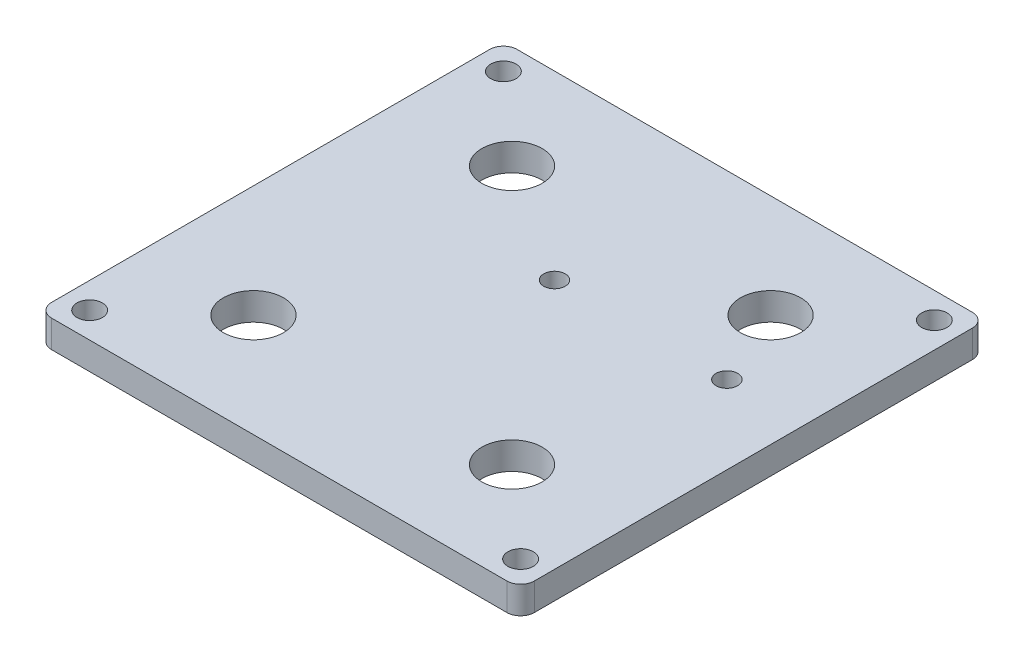
ISO-10303-21;
HEADER;
FILE_DESCRIPTION(('STEP AP214'),'2;1');
FILE_NAME('part.step','',(''),(''),'','','');
FILE_SCHEMA(('AUTOMOTIVE_DESIGN { 1 0 10303 214 1 1 1 1 }'));
ENDSEC;
DATA;
#1=APPLICATION_CONTEXT('core data for automotive mechanical design processes');
#2=APPLICATION_PROTOCOL_DEFINITION('international standard','automotive_design',2000,#1);
#3=PRODUCT_CONTEXT('',#1,'mechanical');
#4=PRODUCT('Part','Part','',(#3));
#5=PRODUCT_RELATED_PRODUCT_CATEGORY('part','',(#4));
#6=PRODUCT_DEFINITION_FORMATION('','',#4);
#7=PRODUCT_DEFINITION_CONTEXT('part definition',#1,'design');
#8=PRODUCT_DEFINITION('design','',#6,#7);
#9=PRODUCT_DEFINITION_SHAPE('','',#8);
#10=(LENGTH_UNIT() NAMED_UNIT(*) SI_UNIT(.MILLI.,.METRE.));
#11=(NAMED_UNIT(*) PLANE_ANGLE_UNIT() SI_UNIT($,.RADIAN.));
#12=(NAMED_UNIT(*) SI_UNIT($,.STERADIAN.) SOLID_ANGLE_UNIT());
#13=UNCERTAINTY_MEASURE_WITH_UNIT(LENGTH_MEASURE(1.E-05),#10,'distance_accuracy_value','');
#14=(GEOMETRIC_REPRESENTATION_CONTEXT(3) GLOBAL_UNCERTAINTY_ASSIGNED_CONTEXT((#13)) GLOBAL_UNIT_ASSIGNED_CONTEXT((#10,
#11,#12)) REPRESENTATION_CONTEXT('',''));
#15=CARTESIAN_POINT('',(0.,0.,0.));
#16=DIRECTION('',(0.,0.,1.));
#17=DIRECTION('',(1.,0.,0.));
#18=AXIS2_PLACEMENT_3D('',#15,#16,#17);
#19=CARTESIAN_POINT('',(0.,0.,0.));
#20=DIRECTION('',(0.,1.,0.));
#21=DIRECTION('',(0.,0.,1.));
#22=AXIS2_PLACEMENT_3D('',#19,#20,#21);
#23=PLANE('',#22);
#24=CARTESIAN_POINT('',(40.93,0.,16.));
#25=DIRECTION('',(0.,1.,0.));
#26=DIRECTION('',(0.,0.,1.));
#27=AXIS2_PLACEMENT_3D('',#24,#25,#26);
#28=CIRCLE('',#27,1.25);
#29=CARTESIAN_POINT('',(40.93,0.,17.25));
#30=VERTEX_POINT('',#29);
#31=EDGE_CURVE('E616',#30,#30,#28,.T.);
#32=ORIENTED_EDGE('',*,*,#31,.T.);
#33=EDGE_LOOP('',(#32));
#34=FACE_BOUND('',#33,.T.);
#35=CARTESIAN_POINT('',(20.93,0.,16.));
#36=DIRECTION('',(0.,1.,0.));
#37=DIRECTION('',(0.,0.,1.));
#38=AXIS2_PLACEMENT_3D('',#35,#36,#37);
#39=CIRCLE('',#38,1.25);
#40=CARTESIAN_POINT('',(20.93,0.,17.25));
#41=VERTEX_POINT('',#40);
#42=EDGE_CURVE('E305',#41,#41,#39,.T.);
#43=ORIENTED_EDGE('',*,*,#42,.T.);
#44=EDGE_LOOP('',(#43));
#45=FACE_BOUND('',#44,.T.);
#46=DIRECTION('',(1.,0.,0.));
#47=VECTOR('',#46,1.);
#48=CARTESIAN_POINT('',(0.,0.,-5.));
#49=LINE('',#48,#47);
#50=CARTESIAN_POINT('',(-4.41249999999999,0.,-5.));
#51=VERTEX_POINT('',#50);
#52=CARTESIAN_POINT('',(48.4125,0.,-5.));
#53=VERTEX_POINT('',#52);
#54=EDGE_CURVE('E146',#51,#53,#49,.T.);
#55=ORIENTED_EDGE('',*,*,#54,.T.);
#56=CARTESIAN_POINT('',(48.4125,0.,-3.4125));
#57=DIRECTION('',(0.,1.,0.));
#58=DIRECTION('',(0.,0.,1.));
#59=AXIS2_PLACEMENT_3D('',#56,#57,#58);
#60=CIRCLE('',#59,1.5875);
#61=CARTESIAN_POINT('',(50.,0.,-3.4125));
#62=VERTEX_POINT('',#61);
#63=EDGE_CURVE('E140',#53,#62,#60,.F.);
#64=ORIENTED_EDGE('',*,*,#63,.T.);
#65=DIRECTION('',(0.,0.,1.));
#66=VECTOR('',#65,1.);
#67=CARTESIAN_POINT('',(50.,0.,-5.00000000000001));
#68=LINE('',#67,#66);
#69=CARTESIAN_POINT('',(50.,0.,47.4125));
#70=VERTEX_POINT('',#69);
#71=EDGE_CURVE('E143',#62,#70,#68,.T.);
#72=ORIENTED_EDGE('',*,*,#71,.T.);
#73=CARTESIAN_POINT('',(48.4125,0.,47.4125));
#74=DIRECTION('',(0.,1.,0.));
#75=DIRECTION('',(0.,0.,1.));
#76=AXIS2_PLACEMENT_3D('',#73,#74,#75);
#77=CIRCLE('',#76,1.5875);
#78=CARTESIAN_POINT('',(48.4125,0.,49.));
#79=VERTEX_POINT('',#78);
#80=EDGE_CURVE('E152',#70,#79,#77,.F.);
#81=ORIENTED_EDGE('',*,*,#80,.T.);
#82=DIRECTION('',(1.,0.,0.));
#83=VECTOR('',#82,1.);
#84=CARTESIAN_POINT('',(0.,0.,49.));
#85=LINE('',#84,#83);
#86=CARTESIAN_POINT('',(-4.41249999999999,0.,49.));
#87=VERTEX_POINT('',#86);
#88=EDGE_CURVE('E213',#87,#79,#85,.T.);
#89=ORIENTED_EDGE('',*,*,#88,.F.);
#90=CARTESIAN_POINT('',(-4.41249999999999,0.,47.4125));
#91=DIRECTION('',(0.,1.,0.));
#92=DIRECTION('',(0.,0.,1.));
#93=AXIS2_PLACEMENT_3D('',#90,#91,#92);
#94=CIRCLE('',#93,1.5875);
#95=CARTESIAN_POINT('',(-5.99999999999999,0.,47.4125));
#96=VERTEX_POINT('',#95);
#97=EDGE_CURVE('E95',#87,#96,#94,.F.);
#98=ORIENTED_EDGE('',*,*,#97,.T.);
#99=DIRECTION('',(0.,0.,-1.));
#100=VECTOR('',#99,1.);
#101=CARTESIAN_POINT('',(-5.99999999999999,0.,-5.));
#102=LINE('',#101,#100);
#103=CARTESIAN_POINT('',(-5.99999999999999,0.,-3.4125));
#104=VERTEX_POINT('',#103);
#105=EDGE_CURVE('E309',#96,#104,#102,.T.);
#106=ORIENTED_EDGE('',*,*,#105,.T.);
#107=CARTESIAN_POINT('',(-4.41249999999999,0.,-3.4125));
#108=DIRECTION('',(0.,1.,0.));
#109=DIRECTION('',(0.,0.,1.));
#110=AXIS2_PLACEMENT_3D('',#107,#108,#109);
#111=CIRCLE('',#110,1.5875);
#112=EDGE_CURVE('E193',#104,#51,#111,.F.);
#113=ORIENTED_EDGE('',*,*,#112,.T.);
#114=EDGE_LOOP('',(#55,#64,#72,#81,#89,#98,#106,#113));
#115=FACE_BOUND('',#114,.T.);
#116=CARTESIAN_POINT('',(7.,0.,7.));
#117=DIRECTION('',(0.,1.,0.));
#118=DIRECTION('',(0.,0.,1.));
#119=AXIS2_PLACEMENT_3D('',#116,#117,#118);
#120=CIRCLE('',#119,3.5);
#121=CARTESIAN_POINT('',(7.,0.,10.5));
#122=VERTEX_POINT('',#121);
#123=EDGE_CURVE('E241',#122,#122,#120,.T.);
#124=ORIENTED_EDGE('',*,*,#123,.T.);
#125=EDGE_LOOP('',(#124));
#126=FACE_BOUND('',#125,.T.);
#127=CARTESIAN_POINT('',(37.,0.,7.));
#128=DIRECTION('',(0.,1.,0.));
#129=DIRECTION('',(0.,0.,1.));
#130=AXIS2_PLACEMENT_3D('',#127,#128,#129);
#131=CIRCLE('',#130,3.5);
#132=CARTESIAN_POINT('',(37.,0.,10.5));
#133=VERTEX_POINT('',#132);
#134=EDGE_CURVE('E237',#133,#133,#131,.T.);
#135=ORIENTED_EDGE('',*,*,#134,.T.);
#136=EDGE_LOOP('',(#135));
#137=FACE_BOUND('',#136,.T.);
#138=CARTESIAN_POINT('',(37.,0.,37.));
#139=DIRECTION('',(0.,1.,0.));
#140=DIRECTION('',(0.,0.,1.));
#141=AXIS2_PLACEMENT_3D('',#138,#139,#140);
#142=CIRCLE('',#141,3.5);
#143=CARTESIAN_POINT('',(37.,0.,40.5));
#144=VERTEX_POINT('',#143);
#145=EDGE_CURVE('E232',#144,#144,#142,.T.);
#146=ORIENTED_EDGE('',*,*,#145,.T.);
#147=EDGE_LOOP('',(#146));
#148=FACE_BOUND('',#147,.T.);
#149=CARTESIAN_POINT('',(7.,0.,37.));
#150=DIRECTION('',(0.,1.,0.));
#151=DIRECTION('',(0.,0.,1.));
#152=AXIS2_PLACEMENT_3D('',#149,#150,#151);
#153=CIRCLE('',#152,3.5);
#154=CARTESIAN_POINT('',(7.,0.,40.5));
#155=VERTEX_POINT('',#154);
#156=EDGE_CURVE('E228',#155,#155,#153,.T.);
#157=ORIENTED_EDGE('',*,*,#156,.T.);
#158=EDGE_LOOP('',(#157));
#159=FACE_BOUND('',#158,.T.);
#160=CARTESIAN_POINT('',(-2.99999999999999,0.,-2.));
#161=DIRECTION('',(0.,1.,0.));
#162=DIRECTION('',(0.,0.,1.));
#163=AXIS2_PLACEMENT_3D('',#160,#161,#162);
#164=CIRCLE('',#163,1.4732);
#165=CARTESIAN_POINT('',(-2.99999999999999,0.,-0.526800000000005));
#166=VERTEX_POINT('',#165);
#167=EDGE_CURVE('E259',#166,#166,#164,.F.);
#168=ORIENTED_EDGE('',*,*,#167,.F.);
#169=EDGE_LOOP('',(#168));
#170=FACE_BOUND('',#169,.T.);
#171=CARTESIAN_POINT('',(-3.,0.,46.));
#172=DIRECTION('',(0.,1.,0.));
#173=DIRECTION('',(0.,0.,1.));
#174=AXIS2_PLACEMENT_3D('',#171,#172,#173);
#175=CIRCLE('',#174,1.4732);
#176=CARTESIAN_POINT('',(-3.,0.,47.4732));
#177=VERTEX_POINT('',#176);
#178=EDGE_CURVE('E233',#177,#177,#175,.F.);
#179=ORIENTED_EDGE('',*,*,#178,.F.);
#180=EDGE_LOOP('',(#179));
#181=FACE_BOUND('',#180,.T.);
#182=CARTESIAN_POINT('',(47.,0.,-2.00000000000001));
#183=DIRECTION('',(0.,1.,0.));
#184=DIRECTION('',(0.,0.,1.));
#185=AXIS2_PLACEMENT_3D('',#182,#183,#184);
#186=CIRCLE('',#185,1.4732);
#187=CARTESIAN_POINT('',(47.,0.,-0.526800000000005));
#188=VERTEX_POINT('',#187);
#189=EDGE_CURVE('E164',#188,#188,#186,.F.);
#190=ORIENTED_EDGE('',*,*,#189,.F.);
#191=EDGE_LOOP('',(#190));
#192=FACE_BOUND('',#191,.T.);
#193=CARTESIAN_POINT('',(47.,0.,46.));
#194=DIRECTION('',(0.,1.,0.));
#195=DIRECTION('',(0.,0.,1.));
#196=AXIS2_PLACEMENT_3D('',#193,#194,#195);
#197=CIRCLE('',#196,1.4732);
#198=CARTESIAN_POINT('',(47.,0.,47.4732));
#199=VERTEX_POINT('',#198);
#200=EDGE_CURVE('E301',#199,#199,#197,.F.);
#201=ORIENTED_EDGE('',*,*,#200,.F.);
#202=EDGE_LOOP('',(#201));
#203=FACE_BOUND('',#202,.T.);
#204=ADVANCED_FACE('F73',(#34,#45,#115,#126,#137,#148,#159,#170,#181,#192,#203),#23,.F.);
#205=CARTESIAN_POINT('',(0.,3.175,-5.));
#206=DIRECTION('',(0.,0.,-1.));
#207=DIRECTION('',(-1.,0.,0.));
#208=AXIS2_PLACEMENT_3D('',#205,#206,#207);
#209=PLANE('',#208);
#210=DIRECTION('',(1.,0.,0.));
#211=VECTOR('',#210,1.);
#212=CARTESIAN_POINT('',(0.,3.175,-5.));
#213=LINE('',#212,#211);
#214=CARTESIAN_POINT('',(-4.41249999999999,3.175,-5.));
#215=VERTEX_POINT('',#214);
#216=CARTESIAN_POINT('',(48.4125,3.175,-5.));
#217=VERTEX_POINT('',#216);
#218=EDGE_CURVE('E220',#215,#217,#213,.T.);
#219=ORIENTED_EDGE('',*,*,#218,.T.);
#220=DIRECTION('',(0.,1.,0.));
#221=VECTOR('',#220,1.);
#222=CARTESIAN_POINT('',(48.4125,3.175,-5.));
#223=LINE('',#222,#221);
#224=EDGE_CURVE('E190',#217,#53,#223,.F.);
#225=ORIENTED_EDGE('',*,*,#224,.T.);
#226=ORIENTED_EDGE('',*,*,#54,.F.);
#227=DIRECTION('',(0.,1.,0.));
#228=VECTOR('',#227,1.);
#229=CARTESIAN_POINT('',(-4.41249999999999,3.175,-5.));
#230=LINE('',#229,#228);
#231=EDGE_CURVE('E186',#51,#215,#230,.T.);
#232=ORIENTED_EDGE('',*,*,#231,.T.);
#233=EDGE_LOOP('',(#219,#225,#226,#232));
#234=FACE_BOUND('',#233,.T.);
#235=ADVANCED_FACE('F273',(#234),#209,.T.);
#236=CARTESIAN_POINT('',(0.,3.175,0.));
#237=DIRECTION('',(0.,1.,0.));
#238=DIRECTION('',(0.,0.,1.));
#239=AXIS2_PLACEMENT_3D('',#236,#237,#238);
#240=PLANE('',#239);
#241=CARTESIAN_POINT('',(40.93,3.175,16.));
#242=DIRECTION('',(0.,1.,0.));
#243=DIRECTION('',(0.,0.,1.));
#244=AXIS2_PLACEMENT_3D('',#241,#242,#243);
#245=CIRCLE('',#244,1.25);
#246=CARTESIAN_POINT('',(40.93,3.175,17.25));
#247=VERTEX_POINT('',#246);
#248=EDGE_CURVE('E619',#247,#247,#245,.T.);
#249=ORIENTED_EDGE('',*,*,#248,.F.);
#250=EDGE_LOOP('',(#249));
#251=FACE_BOUND('',#250,.T.);
#252=CARTESIAN_POINT('',(20.93,3.175,16.));
#253=DIRECTION('',(0.,1.,0.));
#254=DIRECTION('',(0.,0.,1.));
#255=AXIS2_PLACEMENT_3D('',#252,#253,#254);
#256=CIRCLE('',#255,1.25);
#257=CARTESIAN_POINT('',(20.93,3.175,17.25));
#258=VERTEX_POINT('',#257);
#259=EDGE_CURVE('E612',#258,#258,#256,.T.);
#260=ORIENTED_EDGE('',*,*,#259,.F.);
#261=EDGE_LOOP('',(#260));
#262=FACE_BOUND('',#261,.T.);
#263=DIRECTION('',(0.,0.,-1.));
#264=VECTOR('',#263,1.);
#265=CARTESIAN_POINT('',(50.,3.175,-5.00000000000001));
#266=LINE('',#265,#264);
#267=CARTESIAN_POINT('',(50.,3.175,47.4125));
#268=VERTEX_POINT('',#267);
#269=CARTESIAN_POINT('',(50.,3.175,-3.4125));
#270=VERTEX_POINT('',#269);
#271=EDGE_CURVE('E163',#268,#270,#266,.T.);
#272=ORIENTED_EDGE('',*,*,#271,.T.);
#273=CARTESIAN_POINT('',(48.4125,3.175,-3.4125));
#274=DIRECTION('',(0.,1.,0.));
#275=DIRECTION('',(0.,0.,1.));
#276=AXIS2_PLACEMENT_3D('',#273,#274,#275);
#277=CIRCLE('',#276,1.5875);
#278=EDGE_CURVE('E167',#270,#217,#277,.T.);
#279=ORIENTED_EDGE('',*,*,#278,.T.);
#280=ORIENTED_EDGE('',*,*,#218,.F.);
#281=CARTESIAN_POINT('',(-4.41249999999999,3.175,-3.4125));
#282=DIRECTION('',(0.,1.,0.));
#283=DIRECTION('',(0.,0.,1.));
#284=AXIS2_PLACEMENT_3D('',#281,#282,#283);
#285=CIRCLE('',#284,1.5875);
#286=CARTESIAN_POINT('',(-5.99999999999999,3.175,-3.4125));
#287=VERTEX_POINT('',#286);
#288=EDGE_CURVE('E169',#215,#287,#285,.T.);
#289=ORIENTED_EDGE('',*,*,#288,.T.);
#290=DIRECTION('',(0.,0.,1.));
#291=VECTOR('',#290,1.);
#292=CARTESIAN_POINT('',(-5.99999999999999,3.175,-5.));
#293=LINE('',#292,#291);
#294=CARTESIAN_POINT('',(-5.99999999999999,3.175,47.4125));
#295=VERTEX_POINT('',#294);
#296=EDGE_CURVE('E312',#287,#295,#293,.T.);
#297=ORIENTED_EDGE('',*,*,#296,.T.);
#298=CARTESIAN_POINT('',(-4.41249999999999,3.175,47.4125));
#299=DIRECTION('',(0.,1.,0.));
#300=DIRECTION('',(0.,0.,1.));
#301=AXIS2_PLACEMENT_3D('',#298,#299,#300);
#302=CIRCLE('',#301,1.5875);
#303=CARTESIAN_POINT('',(-4.41249999999999,3.175,49.));
#304=VERTEX_POINT('',#303);
#305=EDGE_CURVE('E173',#295,#304,#302,.T.);
#306=ORIENTED_EDGE('',*,*,#305,.T.);
#307=DIRECTION('',(1.,0.,0.));
#308=VECTOR('',#307,1.);
#309=CARTESIAN_POINT('',(0.,3.175,49.));
#310=LINE('',#309,#308);
#311=CARTESIAN_POINT('',(48.4125,3.175,49.));
#312=VERTEX_POINT('',#311);
#313=EDGE_CURVE('E175',#304,#312,#310,.T.);
#314=ORIENTED_EDGE('',*,*,#313,.T.);
#315=CARTESIAN_POINT('',(48.4125,3.175,47.4125));
#316=DIRECTION('',(0.,1.,0.));
#317=DIRECTION('',(0.,0.,1.));
#318=AXIS2_PLACEMENT_3D('',#315,#316,#317);
#319=CIRCLE('',#318,1.5875);
#320=EDGE_CURVE('E181',#312,#268,#319,.T.);
#321=ORIENTED_EDGE('',*,*,#320,.T.);
#322=EDGE_LOOP('',(#272,#279,#280,#289,#297,#306,#314,#321));
#323=FACE_BOUND('',#322,.T.);
#324=CARTESIAN_POINT('',(7.,3.175,37.));
#325=DIRECTION('',(0.,1.,0.));
#326=DIRECTION('',(0.,0.,1.));
#327=AXIS2_PLACEMENT_3D('',#324,#325,#326);
#328=CIRCLE('',#327,3.5);
#329=CARTESIAN_POINT('',(7.,3.175,40.5));
#330=VERTEX_POINT('',#329);
#331=EDGE_CURVE('E247',#330,#330,#328,.T.);
#332=ORIENTED_EDGE('',*,*,#331,.F.);
#333=EDGE_LOOP('',(#332));
#334=FACE_BOUND('',#333,.T.);
#335=CARTESIAN_POINT('',(37.,3.175,37.));
#336=DIRECTION('',(0.,1.,0.));
#337=DIRECTION('',(0.,0.,1.));
#338=AXIS2_PLACEMENT_3D('',#335,#336,#337);
#339=CIRCLE('',#338,3.5);
#340=CARTESIAN_POINT('',(37.,3.175,40.5));
#341=VERTEX_POINT('',#340);
#342=EDGE_CURVE('E250',#341,#341,#339,.T.);
#343=ORIENTED_EDGE('',*,*,#342,.F.);
#344=EDGE_LOOP('',(#343));
#345=FACE_BOUND('',#344,.T.);
#346=CARTESIAN_POINT('',(37.,3.175,7.));
#347=DIRECTION('',(0.,1.,0.));
#348=DIRECTION('',(0.,0.,1.));
#349=AXIS2_PLACEMENT_3D('',#346,#347,#348);
#350=CIRCLE('',#349,3.5);
#351=CARTESIAN_POINT('',(37.,3.175,10.5));
#352=VERTEX_POINT('',#351);
#353=EDGE_CURVE('E256',#352,#352,#350,.T.);
#354=ORIENTED_EDGE('',*,*,#353,.F.);
#355=EDGE_LOOP('',(#354));
#356=FACE_BOUND('',#355,.T.);
#357=CARTESIAN_POINT('',(7.,3.175,7.));
#358=DIRECTION('',(0.,1.,0.));
#359=DIRECTION('',(0.,0.,1.));
#360=AXIS2_PLACEMENT_3D('',#357,#358,#359);
#361=CIRCLE('',#360,3.5);
#362=CARTESIAN_POINT('',(7.,3.175,10.5));
#363=VERTEX_POINT('',#362);
#364=EDGE_CURVE('E224',#363,#363,#361,.T.);
#365=ORIENTED_EDGE('',*,*,#364,.F.);
#366=EDGE_LOOP('',(#365));
#367=FACE_BOUND('',#366,.T.);
#368=CARTESIAN_POINT('',(-2.99999999999999,3.175,-2.));
#369=DIRECTION('',(0.,1.,0.));
#370=DIRECTION('',(0.,0.,1.));
#371=AXIS2_PLACEMENT_3D('',#368,#369,#370);
#372=CIRCLE('',#371,1.4732);
#373=CARTESIAN_POINT('',(-2.99999999999999,3.175,-0.526800000000005));
#374=VERTEX_POINT('',#373);
#375=EDGE_CURVE('E280',#374,#374,#372,.T.);
#376=ORIENTED_EDGE('',*,*,#375,.F.);
#377=EDGE_LOOP('',(#376));
#378=FACE_BOUND('',#377,.T.);
#379=CARTESIAN_POINT('',(-3.,3.175,46.));
#380=DIRECTION('',(0.,1.,0.));
#381=DIRECTION('',(0.,0.,1.));
#382=AXIS2_PLACEMENT_3D('',#379,#380,#381);
#383=CIRCLE('',#382,1.4732);
#384=CARTESIAN_POINT('',(-3.,3.175,47.4732));
#385=VERTEX_POINT('',#384);
#386=EDGE_CURVE('E284',#385,#385,#383,.T.);
#387=ORIENTED_EDGE('',*,*,#386,.F.);
#388=EDGE_LOOP('',(#387));
#389=FACE_BOUND('',#388,.T.);
#390=CARTESIAN_POINT('',(47.,3.175,-2.00000000000001));
#391=DIRECTION('',(0.,1.,0.));
#392=DIRECTION('',(0.,0.,1.));
#393=AXIS2_PLACEMENT_3D('',#390,#391,#392);
#394=CIRCLE('',#393,1.4732);
#395=CARTESIAN_POINT('',(47.,3.175,-0.526800000000005));
#396=VERTEX_POINT('',#395);
#397=EDGE_CURVE('E288',#396,#396,#394,.T.);
#398=ORIENTED_EDGE('',*,*,#397,.F.);
#399=EDGE_LOOP('',(#398));
#400=FACE_BOUND('',#399,.T.);
#401=CARTESIAN_POINT('',(47.,3.175,46.));
#402=DIRECTION('',(0.,1.,0.));
#403=DIRECTION('',(0.,0.,1.));
#404=AXIS2_PLACEMENT_3D('',#401,#402,#403);
#405=CIRCLE('',#404,1.4732);
#406=CARTESIAN_POINT('',(47.,3.175,47.4732));
#407=VERTEX_POINT('',#406);
#408=EDGE_CURVE('E291',#407,#407,#405,.T.);
#409=ORIENTED_EDGE('',*,*,#408,.F.);
#410=EDGE_LOOP('',(#409));
#411=FACE_BOUND('',#410,.T.);
#412=ADVANCED_FACE('F216',(#251,#262,#323,#334,#345,#356,#367,#378,#389,#400,#411),#240,.T.);
#413=CARTESIAN_POINT('',(0.,3.175,49.));
#414=DIRECTION('',(0.,0.,-1.));
#415=DIRECTION('',(-1.,0.,0.));
#416=AXIS2_PLACEMENT_3D('',#413,#414,#415);
#417=PLANE('',#416);
#418=ORIENTED_EDGE('',*,*,#88,.T.);
#419=DIRECTION('',(0.,1.,0.));
#420=VECTOR('',#419,1.);
#421=CARTESIAN_POINT('',(48.4125,3.175,49.));
#422=LINE('',#421,#420);
#423=EDGE_CURVE('E202',#79,#312,#422,.T.);
#424=ORIENTED_EDGE('',*,*,#423,.T.);
#425=ORIENTED_EDGE('',*,*,#313,.F.);
#426=DIRECTION('',(0.,1.,0.));
#427=VECTOR('',#426,1.);
#428=CARTESIAN_POINT('',(-4.41249999999999,0.,49.));
#429=LINE('',#428,#427);
#430=EDGE_CURVE('E151',#304,#87,#429,.F.);
#431=ORIENTED_EDGE('',*,*,#430,.T.);
#432=EDGE_LOOP('',(#418,#424,#425,#431));
#433=FACE_BOUND('',#432,.T.);
#434=ADVANCED_FACE('F211',(#433),#417,.F.);
#435=CARTESIAN_POINT('',(7.,3.175,37.));
#436=DIRECTION('',(0.,-1.,0.));
#437=DIRECTION('',(0.,0.,-1.));
#438=AXIS2_PLACEMENT_3D('',#435,#436,#437);
#439=CYLINDRICAL_SURFACE('',#438,3.5);
#440=ORIENTED_EDGE('',*,*,#331,.T.);
#441=EDGE_LOOP('',(#440));
#442=FACE_BOUND('',#441,.T.);
#443=ORIENTED_EDGE('',*,*,#156,.F.);
#444=EDGE_LOOP('',(#443));
#445=FACE_BOUND('',#444,.T.);
#446=ADVANCED_FACE('F343',(#442,#445),#439,.F.);
#447=CARTESIAN_POINT('',(37.,3.175,37.));
#448=DIRECTION('',(0.,-1.,0.));
#449=DIRECTION('',(0.,0.,-1.));
#450=AXIS2_PLACEMENT_3D('',#447,#448,#449);
#451=CYLINDRICAL_SURFACE('',#450,3.5);
#452=ORIENTED_EDGE('',*,*,#342,.T.);
#453=EDGE_LOOP('',(#452));
#454=FACE_BOUND('',#453,.T.);
#455=ORIENTED_EDGE('',*,*,#145,.F.);
#456=EDGE_LOOP('',(#455));
#457=FACE_BOUND('',#456,.T.);
#458=ADVANCED_FACE('F347',(#454,#457),#451,.F.);
#459=CARTESIAN_POINT('',(37.,3.175,7.));
#460=DIRECTION('',(0.,-1.,0.));
#461=DIRECTION('',(0.,0.,-1.));
#462=AXIS2_PLACEMENT_3D('',#459,#460,#461);
#463=CYLINDRICAL_SURFACE('',#462,3.5);
#464=ORIENTED_EDGE('',*,*,#353,.T.);
#465=EDGE_LOOP('',(#464));
#466=FACE_BOUND('',#465,.T.);
#467=ORIENTED_EDGE('',*,*,#134,.F.);
#468=EDGE_LOOP('',(#467));
#469=FACE_BOUND('',#468,.T.);
#470=ADVANCED_FACE('F352',(#466,#469),#463,.F.);
#471=CARTESIAN_POINT('',(7.,3.175,7.));
#472=DIRECTION('',(0.,-1.,0.));
#473=DIRECTION('',(0.,0.,-1.));
#474=AXIS2_PLACEMENT_3D('',#471,#472,#473);
#475=CYLINDRICAL_SURFACE('',#474,3.5);
#476=ORIENTED_EDGE('',*,*,#364,.T.);
#477=EDGE_LOOP('',(#476));
#478=FACE_BOUND('',#477,.T.);
#479=ORIENTED_EDGE('',*,*,#123,.F.);
#480=EDGE_LOOP('',(#479));
#481=FACE_BOUND('',#480,.T.);
#482=ADVANCED_FACE('F268',(#478,#481),#475,.F.);
#483=CARTESIAN_POINT('',(-5.99999999999999,-54.3323108288245,-5.));
#484=DIRECTION('',(-1.,0.,0.));
#485=DIRECTION('',(0.,0.,1.));
#486=AXIS2_PLACEMENT_3D('',#483,#484,#485);
#487=PLANE('',#486);
#488=ORIENTED_EDGE('',*,*,#105,.F.);
#489=DIRECTION('',(0.,1.,0.));
#490=VECTOR('',#489,1.);
#491=CARTESIAN_POINT('',(-5.99999999999999,3.175,47.4125));
#492=LINE('',#491,#490);
#493=EDGE_CURVE('E12',#96,#295,#492,.T.);
#494=ORIENTED_EDGE('',*,*,#493,.T.);
#495=ORIENTED_EDGE('',*,*,#296,.F.);
#496=DIRECTION('',(0.,1.,0.));
#497=VECTOR('',#496,1.);
#498=CARTESIAN_POINT('',(-5.99999999999999,-54.3323108288245,-3.4125));
#499=LINE('',#498,#497);
#500=EDGE_CURVE('E82',#287,#104,#499,.F.);
#501=ORIENTED_EDGE('',*,*,#500,.T.);
#502=EDGE_LOOP('',(#488,#494,#495,#501));
#503=FACE_BOUND('',#502,.T.);
#504=ADVANCED_FACE('F276',(#503),#487,.T.);
#505=CARTESIAN_POINT('',(-3.,-54.3323108288245,46.));
#506=DIRECTION('',(0.,1.,0.));
#507=DIRECTION('',(0.,0.,1.));
#508=AXIS2_PLACEMENT_3D('',#505,#506,#507);
#509=CYLINDRICAL_SURFACE('',#508,1.4732);
#510=ORIENTED_EDGE('',*,*,#178,.T.);
#511=EDGE_LOOP('',(#510));
#512=FACE_BOUND('',#511,.T.);
#513=ORIENTED_EDGE('',*,*,#386,.T.);
#514=EDGE_LOOP('',(#513));
#515=FACE_BOUND('',#514,.T.);
#516=ADVANCED_FACE('F388',(#512,#515),#509,.F.);
#517=CARTESIAN_POINT('',(-2.99999999999999,-54.3323108288245,-2.));
#518=DIRECTION('',(0.,1.,0.));
#519=DIRECTION('',(0.,0.,1.));
#520=AXIS2_PLACEMENT_3D('',#517,#518,#519);
#521=CYLINDRICAL_SURFACE('',#520,1.4732);
#522=ORIENTED_EDGE('',*,*,#167,.T.);
#523=EDGE_LOOP('',(#522));
#524=FACE_BOUND('',#523,.T.);
#525=ORIENTED_EDGE('',*,*,#375,.T.);
#526=EDGE_LOOP('',(#525));
#527=FACE_BOUND('',#526,.T.);
#528=ADVANCED_FACE('F379',(#524,#527),#521,.F.);
#529=CARTESIAN_POINT('',(50.,-54.3323108288245,-5.00000000000001));
#530=DIRECTION('',(1.,0.,0.));
#531=DIRECTION('',(0.,0.,-1.));
#532=AXIS2_PLACEMENT_3D('',#529,#530,#531);
#533=PLANE('',#532);
#534=ORIENTED_EDGE('',*,*,#71,.F.);
#535=DIRECTION('',(0.,1.,0.));
#536=VECTOR('',#535,1.);
#537=CARTESIAN_POINT('',(50.,-54.3323108288245,-3.4125));
#538=LINE('',#537,#536);
#539=EDGE_CURVE('E158',#62,#270,#538,.T.);
#540=ORIENTED_EDGE('',*,*,#539,.T.);
#541=ORIENTED_EDGE('',*,*,#271,.F.);
#542=DIRECTION('',(0.,1.,0.));
#543=VECTOR('',#542,1.);
#544=CARTESIAN_POINT('',(50.,0.,47.4125));
#545=LINE('',#544,#543);
#546=EDGE_CURVE('E161',#268,#70,#545,.F.);
#547=ORIENTED_EDGE('',*,*,#546,.T.);
#548=EDGE_LOOP('',(#534,#540,#541,#547));
#549=FACE_BOUND('',#548,.T.);
#550=ADVANCED_FACE('F156',(#549),#533,.T.);
#551=CARTESIAN_POINT('',(47.,-54.3323108288245,46.));
#552=DIRECTION('',(0.,1.,0.));
#553=DIRECTION('',(0.,0.,1.));
#554=AXIS2_PLACEMENT_3D('',#551,#552,#553);
#555=CYLINDRICAL_SURFACE('',#554,1.4732);
#556=ORIENTED_EDGE('',*,*,#200,.T.);
#557=EDGE_LOOP('',(#556));
#558=FACE_BOUND('',#557,.T.);
#559=ORIENTED_EDGE('',*,*,#408,.T.);
#560=EDGE_LOOP('',(#559));
#561=FACE_BOUND('',#560,.T.);
#562=ADVANCED_FACE('F378',(#558,#561),#555,.F.);
#563=CARTESIAN_POINT('',(47.,-54.3323108288245,-2.00000000000001));
#564=DIRECTION('',(0.,1.,0.));
#565=DIRECTION('',(0.,0.,1.));
#566=AXIS2_PLACEMENT_3D('',#563,#564,#565);
#567=CYLINDRICAL_SURFACE('',#566,1.4732);
#568=ORIENTED_EDGE('',*,*,#189,.T.);
#569=EDGE_LOOP('',(#568));
#570=FACE_BOUND('',#569,.T.);
#571=ORIENTED_EDGE('',*,*,#397,.T.);
#572=EDGE_LOOP('',(#571));
#573=FACE_BOUND('',#572,.T.);
#574=ADVANCED_FACE('F370',(#570,#573),#567,.F.);
#575=CARTESIAN_POINT('',(20.93,3.175,16.));
#576=DIRECTION('',(0.,1.,0.));
#577=DIRECTION('',(0.,0.,1.));
#578=AXIS2_PLACEMENT_3D('',#575,#576,#577);
#579=CYLINDRICAL_SURFACE('',#578,1.25);
#580=ORIENTED_EDGE('',*,*,#42,.F.);
#581=EDGE_LOOP('',(#580));
#582=FACE_BOUND('',#581,.T.);
#583=ORIENTED_EDGE('',*,*,#259,.T.);
#584=EDGE_LOOP('',(#583));
#585=FACE_BOUND('',#584,.T.);
#586=ADVANCED_FACE('F364',(#582,#585),#579,.F.);
#587=CARTESIAN_POINT('',(40.93,3.175,16.));
#588=DIRECTION('',(0.,1.,0.));
#589=DIRECTION('',(0.,0.,1.));
#590=AXIS2_PLACEMENT_3D('',#587,#588,#589);
#591=CYLINDRICAL_SURFACE('',#590,1.25);
#592=ORIENTED_EDGE('',*,*,#31,.F.);
#593=EDGE_LOOP('',(#592));
#594=FACE_BOUND('',#593,.T.);
#595=ORIENTED_EDGE('',*,*,#248,.T.);
#596=EDGE_LOOP('',(#595));
#597=FACE_BOUND('',#596,.T.);
#598=ADVANCED_FACE('F360',(#594,#597),#591,.F.);
#599=CARTESIAN_POINT('',(48.4125,-54.3323108288245,-3.4125));
#600=DIRECTION('',(0.,1.,0.));
#601=DIRECTION('',(0.,0.,1.));
#602=AXIS2_PLACEMENT_3D('',#599,#600,#601);
#603=CYLINDRICAL_SURFACE('',#602,1.5875);
#604=ORIENTED_EDGE('',*,*,#63,.F.);
#605=ORIENTED_EDGE('',*,*,#224,.F.);
#606=ORIENTED_EDGE('',*,*,#278,.F.);
#607=ORIENTED_EDGE('',*,*,#539,.F.);
#608=EDGE_LOOP('',(#604,#605,#606,#607));
#609=FACE_BOUND('',#608,.T.);
#610=ADVANCED_FACE('F166',(#609),#603,.T.);
#611=CARTESIAN_POINT('',(48.4125,3.175,47.4125));
#612=DIRECTION('',(0.,-1.,0.));
#613=DIRECTION('',(0.,0.,-1.));
#614=AXIS2_PLACEMENT_3D('',#611,#612,#613);
#615=CYLINDRICAL_SURFACE('',#614,1.5875);
#616=ORIENTED_EDGE('',*,*,#80,.F.);
#617=ORIENTED_EDGE('',*,*,#546,.F.);
#618=ORIENTED_EDGE('',*,*,#320,.F.);
#619=ORIENTED_EDGE('',*,*,#423,.F.);
#620=EDGE_LOOP('',(#616,#617,#618,#619));
#621=FACE_BOUND('',#620,.T.);
#622=ADVANCED_FACE('F323',(#621),#615,.T.);
#623=CARTESIAN_POINT('',(-4.41249999999999,-54.3323108288245,47.4125));
#624=DIRECTION('',(0.,-1.,0.));
#625=DIRECTION('',(0.,0.,-1.));
#626=AXIS2_PLACEMENT_3D('',#623,#624,#625);
#627=CYLINDRICAL_SURFACE('',#626,1.5875);
#628=ORIENTED_EDGE('',*,*,#97,.F.);
#629=ORIENTED_EDGE('',*,*,#430,.F.);
#630=ORIENTED_EDGE('',*,*,#305,.F.);
#631=ORIENTED_EDGE('',*,*,#493,.F.);
#632=EDGE_LOOP('',(#628,#629,#630,#631));
#633=FACE_BOUND('',#632,.T.);
#634=ADVANCED_FACE('F325',(#633),#627,.T.);
#635=CARTESIAN_POINT('',(-4.41249999999999,3.175,-3.4125));
#636=DIRECTION('',(0.,1.,0.));
#637=DIRECTION('',(0.,0.,1.));
#638=AXIS2_PLACEMENT_3D('',#635,#636,#637);
#639=CYLINDRICAL_SURFACE('',#638,1.5875);
#640=ORIENTED_EDGE('',*,*,#112,.F.);
#641=ORIENTED_EDGE('',*,*,#500,.F.);
#642=ORIENTED_EDGE('',*,*,#288,.F.);
#643=ORIENTED_EDGE('',*,*,#231,.F.);
#644=EDGE_LOOP('',(#640,#641,#642,#643));
#645=FACE_BOUND('',#644,.T.);
#646=ADVANCED_FACE('F75',(#645),#639,.T.);
#647=CLOSED_SHELL('',(#204,#235,#412,#434,#446,#458,#470,#482,#504,#516,#528,#550,#562,#574,
#586,#598,#610,#622,#634,#646));
#648=MANIFOLD_SOLID_BREP('B2',#647);
#649=ADVANCED_BREP_SHAPE_REPRESENTATION('',(#18,#648),#14);
#650=SHAPE_DEFINITION_REPRESENTATION(#9,#649);
ENDSEC;
END-ISO-10303-21;
